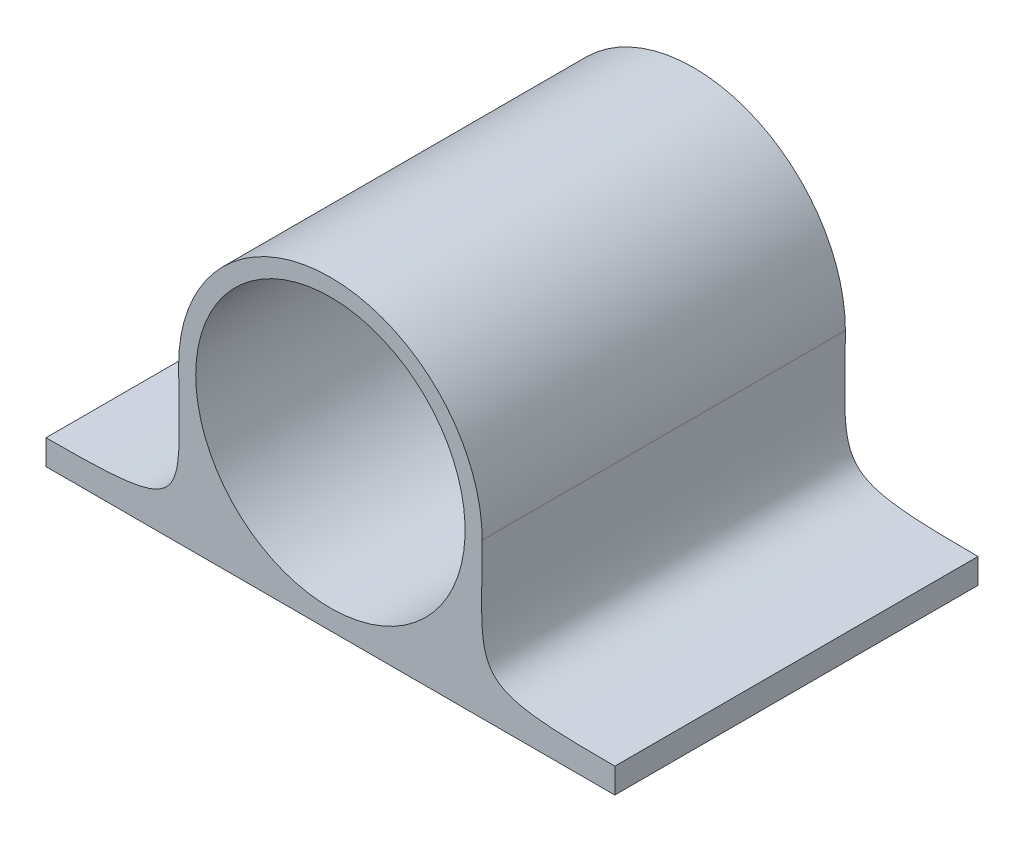
ISO-10303-21;
HEADER;
FILE_DESCRIPTION(('STEP AP214'),'2;1');
FILE_NAME('part.step','',(''),(''),'','','');
FILE_SCHEMA(('AUTOMOTIVE_DESIGN { 1 0 10303 214 1 1 1 1 }'));
ENDSEC;
DATA;
#1=APPLICATION_CONTEXT('core data for automotive mechanical design processes');
#2=APPLICATION_PROTOCOL_DEFINITION('international standard','automotive_design',2000,#1);
#3=PRODUCT_CONTEXT('',#1,'mechanical');
#4=PRODUCT('Part','Part','',(#3));
#5=PRODUCT_RELATED_PRODUCT_CATEGORY('part','',(#4));
#6=PRODUCT_DEFINITION_FORMATION('','',#4);
#7=PRODUCT_DEFINITION_CONTEXT('part definition',#1,'design');
#8=PRODUCT_DEFINITION('design','',#6,#7);
#9=PRODUCT_DEFINITION_SHAPE('','',#8);
#10=(LENGTH_UNIT() NAMED_UNIT(*) SI_UNIT(.MILLI.,.METRE.));
#11=(NAMED_UNIT(*) PLANE_ANGLE_UNIT() SI_UNIT($,.RADIAN.));
#12=(NAMED_UNIT(*) SI_UNIT($,.STERADIAN.) SOLID_ANGLE_UNIT());
#13=UNCERTAINTY_MEASURE_WITH_UNIT(LENGTH_MEASURE(1.E-05),#10,'distance_accuracy_value','');
#14=(GEOMETRIC_REPRESENTATION_CONTEXT(3) GLOBAL_UNCERTAINTY_ASSIGNED_CONTEXT((#13)) GLOBAL_UNIT_ASSIGNED_CONTEXT((#10,
#11,#12)) REPRESENTATION_CONTEXT('',''));
#15=CARTESIAN_POINT('',(0.,0.,0.));
#16=DIRECTION('',(0.,0.,1.));
#17=DIRECTION('',(1.,0.,0.));
#18=AXIS2_PLACEMENT_3D('',#15,#16,#17);
#19=CARTESIAN_POINT('',(0.,0.,58.));
#20=DIRECTION('',(0.,0.,-1.));
#21=DIRECTION('',(-1.,0.,0.));
#22=AXIS2_PLACEMENT_3D('',#19,#20,#21);
#23=CYLINDRICAL_SURFACE('',#22,24.2414756663067);
#24=CARTESIAN_POINT('',(0.,0.,0.));
#25=DIRECTION('',(0.,0.,1.));
#26=DIRECTION('',(1.,0.,0.));
#27=AXIS2_PLACEMENT_3D('',#24,#25,#26);
#28=CIRCLE('',#27,24.2414756663067);
#29=CARTESIAN_POINT('',(24.2414756663067,0.,0.));
#30=VERTEX_POINT('',#29);
#31=CARTESIAN_POINT('',(-24.2414756663067,0.,0.));
#32=VERTEX_POINT('',#31);
#33=EDGE_CURVE('E122',#30,#32,#28,.T.);
#34=ORIENTED_EDGE('',*,*,#33,.T.);
#35=DIRECTION('',(0.,0.,-1.));
#36=VECTOR('',#35,1.);
#37=CARTESIAN_POINT('',(-24.2414756663067,0.,58.));
#38=LINE('',#37,#36);
#39=CARTESIAN_POINT('',(-24.2414756663067,0.,58.));
#40=VERTEX_POINT('',#39);
#41=EDGE_CURVE('E44',#40,#32,#38,.T.);
#42=ORIENTED_EDGE('',*,*,#41,.F.);
#43=CARTESIAN_POINT('',(0.,0.,58.));
#44=DIRECTION('',(0.,0.,1.));
#45=DIRECTION('',(1.,0.,0.));
#46=AXIS2_PLACEMENT_3D('',#43,#44,#45);
#47=CIRCLE('',#46,24.2414756663067);
#48=CARTESIAN_POINT('',(24.2414756663067,0.,58.));
#49=VERTEX_POINT('',#48);
#50=EDGE_CURVE('E83',#49,#40,#47,.T.);
#51=ORIENTED_EDGE('',*,*,#50,.F.);
#52=DIRECTION('',(0.,0.,-1.));
#53=VECTOR('',#52,1.);
#54=CARTESIAN_POINT('',(24.2414756663067,0.,58.));
#55=LINE('',#54,#53);
#56=EDGE_CURVE('E115',#49,#30,#55,.T.);
#57=ORIENTED_EDGE('',*,*,#56,.T.);
#58=EDGE_LOOP('',(#34,#42,#51,#57));
#59=FACE_BOUND('',#58,.T.);
#60=ADVANCED_FACE('F35',(#59),#23,.T.);
#61=CARTESIAN_POINT('',(-45.4219408276064,-20.6662459211709,58.));
#62=CARTESIAN_POINT('',(-21.5322033053492,-20.6662459211709,58.));
#63=CARTESIAN_POINT('',(-24.2414756663066,-19.078845963853,58.));
#64=CARTESIAN_POINT('',(-24.2414756663067,0.,58.));
#65=B_SPLINE_CURVE_WITH_KNOTS('',3,(#61,#62,#63,#64),.UNSPECIFIED.,.F.,.F.,(4,4),(0.,1.),.UNSPECIFIED.);
#66=DIRECTION('',(0.,0.,-1.));
#67=VECTOR('',#66,1.);
#68=SURFACE_OF_LINEAR_EXTRUSION('',#65,#67);
#69=CARTESIAN_POINT('',(-45.4219408276064,-20.6662459211709,0.));
#70=CARTESIAN_POINT('',(-21.5322033053492,-20.6662459211709,0.));
#71=CARTESIAN_POINT('',(-24.2414756663066,-19.078845963853,0.));
#72=CARTESIAN_POINT('',(-24.2414756663067,0.,0.));
#73=B_SPLINE_CURVE_WITH_KNOTS('',3,(#69,#70,#71,#72),.UNSPECIFIED.,.F.,.F.,(4,4),(0.,1.),.UNSPECIFIED.);
#74=CARTESIAN_POINT('',(-45.4219408276064,-20.6662459211709,0.));
#75=VERTEX_POINT('',#74);
#76=EDGE_CURVE('E167',#75,#32,#73,.T.);
#77=ORIENTED_EDGE('',*,*,#76,.F.);
#78=DIRECTION('',(0.,0.,-1.));
#79=VECTOR('',#78,1.);
#80=CARTESIAN_POINT('',(-45.4219408276064,-20.6662459211709,58.));
#81=LINE('',#80,#79);
#82=CARTESIAN_POINT('',(-45.4219408276064,-20.6662459211709,58.));
#83=VERTEX_POINT('',#82);
#84=EDGE_CURVE('E194',#83,#75,#81,.T.);
#85=ORIENTED_EDGE('',*,*,#84,.F.);
#86=EDGE_CURVE('E146',#83,#40,#65,.T.);
#87=ORIENTED_EDGE('',*,*,#86,.T.);
#88=ORIENTED_EDGE('',*,*,#41,.T.);
#89=EDGE_LOOP('',(#77,#85,#87,#88));
#90=FACE_BOUND('',#89,.T.);
#91=ADVANCED_FACE('F141',(#90),#68,.T.);
#92=CARTESIAN_POINT('',(-45.4219408276064,0.,58.));
#93=DIRECTION('',(1.,0.,0.));
#94=DIRECTION('',(0.,0.,-1.));
#95=AXIS2_PLACEMENT_3D('',#92,#93,#94);
#96=PLANE('',#95);
#97=DIRECTION('',(0.,-1.,0.));
#98=VECTOR('',#97,1.);
#99=CARTESIAN_POINT('',(-45.4219408276064,0.,0.));
#100=LINE('',#99,#98);
#101=CARTESIAN_POINT('',(-45.4219408276064,-24.6662459211709,0.));
#102=VERTEX_POINT('',#101);
#103=EDGE_CURVE('E171',#75,#102,#100,.T.);
#104=ORIENTED_EDGE('',*,*,#103,.T.);
#105=DIRECTION('',(0.,0.,-1.));
#106=VECTOR('',#105,1.);
#107=CARTESIAN_POINT('',(-45.4219408276064,-24.6662459211709,58.));
#108=LINE('',#107,#106);
#109=CARTESIAN_POINT('',(-45.4219408276064,-24.6662459211709,58.));
#110=VERTEX_POINT('',#109);
#111=EDGE_CURVE('E111',#110,#102,#108,.T.);
#112=ORIENTED_EDGE('',*,*,#111,.F.);
#113=DIRECTION('',(0.,-1.,0.));
#114=VECTOR('',#113,1.);
#115=CARTESIAN_POINT('',(-45.4219408276064,0.,58.));
#116=LINE('',#115,#114);
#117=EDGE_CURVE('E98',#83,#110,#116,.T.);
#118=ORIENTED_EDGE('',*,*,#117,.F.);
#119=ORIENTED_EDGE('',*,*,#84,.T.);
#120=EDGE_LOOP('',(#104,#112,#118,#119));
#121=FACE_BOUND('',#120,.T.);
#122=ADVANCED_FACE('F138',(#121),#96,.F.);
#123=CARTESIAN_POINT('',(0.,-24.6662459211709,58.));
#124=DIRECTION('',(0.,1.,0.));
#125=DIRECTION('',(0.,0.,1.));
#126=AXIS2_PLACEMENT_3D('',#123,#124,#125);
#127=PLANE('',#126);
#128=DIRECTION('',(1.,0.,0.));
#129=VECTOR('',#128,1.);
#130=CARTESIAN_POINT('',(0.,-24.6662459211709,0.));
#131=LINE('',#130,#129);
#132=CARTESIAN_POINT('',(45.4219408276064,-24.6662459211709,0.));
#133=VERTEX_POINT('',#132);
#134=EDGE_CURVE('E107',#102,#133,#131,.T.);
#135=ORIENTED_EDGE('',*,*,#134,.T.);
#136=DIRECTION('',(0.,0.,-1.));
#137=VECTOR('',#136,1.);
#138=CARTESIAN_POINT('',(45.4219408276064,-24.6662459211709,58.));
#139=LINE('',#138,#137);
#140=CARTESIAN_POINT('',(45.4219408276064,-24.6662459211709,58.));
#141=VERTEX_POINT('',#140);
#142=EDGE_CURVE('E104',#141,#133,#139,.T.);
#143=ORIENTED_EDGE('',*,*,#142,.F.);
#144=DIRECTION('',(1.,0.,0.));
#145=VECTOR('',#144,1.);
#146=CARTESIAN_POINT('',(0.,-24.6662459211709,58.));
#147=LINE('',#146,#145);
#148=EDGE_CURVE('E92',#110,#141,#147,.T.);
#149=ORIENTED_EDGE('',*,*,#148,.F.);
#150=ORIENTED_EDGE('',*,*,#111,.T.);
#151=EDGE_LOOP('',(#135,#143,#149,#150));
#152=FACE_BOUND('',#151,.T.);
#153=ADVANCED_FACE('F105',(#152),#127,.F.);
#154=CARTESIAN_POINT('',(45.4219408276064,0.,58.));
#155=DIRECTION('',(1.,0.,0.));
#156=DIRECTION('',(0.,0.,-1.));
#157=AXIS2_PLACEMENT_3D('',#154,#155,#156);
#158=PLANE('',#157);
#159=DIRECTION('',(0.,-1.,0.));
#160=VECTOR('',#159,1.);
#161=CARTESIAN_POINT('',(45.4219408276064,0.,0.));
#162=LINE('',#161,#160);
#163=CARTESIAN_POINT('',(45.4219408276064,-20.6662459211709,0.));
#164=VERTEX_POINT('',#163);
#165=EDGE_CURVE('E183',#164,#133,#162,.T.);
#166=ORIENTED_EDGE('',*,*,#165,.F.);
#167=DIRECTION('',(0.,0.,-1.));
#168=VECTOR('',#167,1.);
#169=CARTESIAN_POINT('',(45.4219408276064,-20.6662459211709,58.));
#170=LINE('',#169,#168);
#171=CARTESIAN_POINT('',(45.4219408276064,-20.6662459211709,58.));
#172=VERTEX_POINT('',#171);
#173=EDGE_CURVE('E74',#172,#164,#170,.T.);
#174=ORIENTED_EDGE('',*,*,#173,.F.);
#175=DIRECTION('',(0.,-1.,0.));
#176=VECTOR('',#175,1.);
#177=CARTESIAN_POINT('',(45.4219408276064,0.,58.));
#178=LINE('',#177,#176);
#179=EDGE_CURVE('E96',#172,#141,#178,.T.);
#180=ORIENTED_EDGE('',*,*,#179,.T.);
#181=ORIENTED_EDGE('',*,*,#142,.T.);
#182=EDGE_LOOP('',(#166,#174,#180,#181));
#183=FACE_BOUND('',#182,.T.);
#184=ADVANCED_FACE('F113',(#183),#158,.T.);
#185=CARTESIAN_POINT('',(0.,0.,58.));
#186=DIRECTION('',(0.,0.,-1.));
#187=DIRECTION('',(-1.,0.,0.));
#188=AXIS2_PLACEMENT_3D('',#185,#186,#187);
#189=CYLINDRICAL_SURFACE('',#188,21.51);
#190=CARTESIAN_POINT('',(0.,0.,3.));
#191=DIRECTION('',(0.,0.,1.));
#192=DIRECTION('',(1.,0.,0.));
#193=AXIS2_PLACEMENT_3D('',#190,#191,#192);
#194=CIRCLE('',#193,21.51);
#195=CARTESIAN_POINT('',(-21.51,0.,3.));
#196=VERTEX_POINT('',#195);
#197=EDGE_CURVE('E11',#196,#196,#194,.T.);
#198=CARTESIAN_POINT('',(0.,0.,58.));
#199=DIRECTION('',(0.,0.,1.));
#200=DIRECTION('',(1.,0.,0.));
#201=AXIS2_PLACEMENT_3D('',#198,#199,#200);
#202=CIRCLE('',#201,21.51);
#203=CARTESIAN_POINT('',(-21.51,0.,58.));
#204=VERTEX_POINT('',#203);
#205=EDGE_CURVE('E156',#204,#204,#202,.T.);
#206=CARTESIAN_POINT('',(-21.51,0.,3.));
#207=CARTESIAN_POINT('',(-21.51,0.,3.57291666666667));
#208=CARTESIAN_POINT('',(-21.51,0.,4.14583333333333));
#209=CARTESIAN_POINT('',(-21.51,0.,5.29166666666667));
#210=CARTESIAN_POINT('',(-21.51,0.,5.86458333333334));
#211=CARTESIAN_POINT('',(-21.51,0.,7.01041666666667));
#212=CARTESIAN_POINT('',(-21.51,0.,7.58333333333334));
#213=CARTESIAN_POINT('',(-21.51,0.,8.72916666666667));
#214=CARTESIAN_POINT('',(-21.51,0.,9.30208333333334));
#215=CARTESIAN_POINT('',(-21.51,0.,10.4479166666667));
#216=CARTESIAN_POINT('',(-21.51,0.,11.0208333333333));
#217=CARTESIAN_POINT('',(-21.51,0.,12.1666666666667));
#218=CARTESIAN_POINT('',(-21.51,0.,12.7395833333333));
#219=CARTESIAN_POINT('',(-21.51,0.,13.8854166666667));
#220=CARTESIAN_POINT('',(-21.51,0.,14.4583333333333));
#221=CARTESIAN_POINT('',(-21.51,0.,15.6041666666667));
#222=CARTESIAN_POINT('',(-21.51,0.,16.1770833333333));
#223=CARTESIAN_POINT('',(-21.51,0.,17.3229166666667));
#224=CARTESIAN_POINT('',(-21.51,0.,17.8958333333333));
#225=CARTESIAN_POINT('',(-21.51,0.,19.0416666666667));
#226=CARTESIAN_POINT('',(-21.51,0.,19.6145833333333));
#227=CARTESIAN_POINT('',(-21.51,0.,20.7604166666667));
#228=CARTESIAN_POINT('',(-21.51,0.,21.3333333333333));
#229=CARTESIAN_POINT('',(-21.51,0.,22.4791666666667));
#230=CARTESIAN_POINT('',(-21.51,0.,23.0520833333333));
#231=CARTESIAN_POINT('',(-21.51,0.,24.1979166666667));
#232=CARTESIAN_POINT('',(-21.51,0.,24.7708333333333));
#233=CARTESIAN_POINT('',(-21.51,0.,25.9166666666667));
#234=CARTESIAN_POINT('',(-21.51,0.,26.4895833333333));
#235=CARTESIAN_POINT('',(-21.51,0.,27.6354166666667));
#236=CARTESIAN_POINT('',(-21.51,0.,28.2083333333333));
#237=CARTESIAN_POINT('',(-21.51,0.,29.3541666666667));
#238=CARTESIAN_POINT('',(-21.51,0.,29.9270833333333));
#239=CARTESIAN_POINT('',(-21.51,0.,31.0729166666667));
#240=CARTESIAN_POINT('',(-21.51,0.,31.6458333333333));
#241=CARTESIAN_POINT('',(-21.51,0.,32.7916666666667));
#242=CARTESIAN_POINT('',(-21.51,0.,33.3645833333333));
#243=CARTESIAN_POINT('',(-21.51,0.,34.5104166666667));
#244=CARTESIAN_POINT('',(-21.51,0.,35.0833333333333));
#245=CARTESIAN_POINT('',(-21.51,0.,36.2291666666667));
#246=CARTESIAN_POINT('',(-21.51,0.,36.8020833333333));
#247=CARTESIAN_POINT('',(-21.51,0.,37.9479166666667));
#248=CARTESIAN_POINT('',(-21.51,0.,38.5208333333333));
#249=CARTESIAN_POINT('',(-21.51,0.,39.6666666666667));
#250=CARTESIAN_POINT('',(-21.51,0.,40.2395833333333));
#251=CARTESIAN_POINT('',(-21.51,0.,41.3854166666667));
#252=CARTESIAN_POINT('',(-21.51,0.,41.9583333333333));
#253=CARTESIAN_POINT('',(-21.51,0.,43.1041666666667));
#254=CARTESIAN_POINT('',(-21.51,0.,43.6770833333333));
#255=CARTESIAN_POINT('',(-21.51,0.,44.8229166666667));
#256=CARTESIAN_POINT('',(-21.51,0.,45.3958333333333));
#257=CARTESIAN_POINT('',(-21.51,0.,46.5416666666667));
#258=CARTESIAN_POINT('',(-21.51,0.,47.1145833333333));
#259=CARTESIAN_POINT('',(-21.51,0.,48.2604166666667));
#260=CARTESIAN_POINT('',(-21.51,0.,48.8333333333333));
#261=CARTESIAN_POINT('',(-21.51,0.,49.9791666666667));
#262=CARTESIAN_POINT('',(-21.51,0.,50.5520833333333));
#263=CARTESIAN_POINT('',(-21.51,0.,51.6979166666667));
#264=CARTESIAN_POINT('',(-21.51,0.,52.2708333333333));
#265=CARTESIAN_POINT('',(-21.51,0.,53.4166666666667));
#266=CARTESIAN_POINT('',(-21.51,0.,53.9895833333333));
#267=CARTESIAN_POINT('',(-21.51,0.,55.1354166666667));
#268=CARTESIAN_POINT('',(-21.51,0.,55.7083333333333));
#269=CARTESIAN_POINT('',(-21.51,0.,56.8541666666667));
#270=CARTESIAN_POINT('',(-21.51,0.,57.4270833333333));
#271=CARTESIAN_POINT('',(-21.51,0.,58.));
#272=B_SPLINE_CURVE_WITH_KNOTS('',3,(#206,#207,#208,#209,#210,#211,#212,#213,#214,#215,#216,
#217,#218,#219,#220,#221,#222,#223,#224,#225,#226,#227,#228,#229,#230,#231,#232,#233,#234,#235,
#236,#237,#238,#239,#240,#241,#242,#243,#244,#245,#246,#247,#248,#249,#250,#251,#252,#253,#254,
#255,#256,#257,#258,#259,#260,#261,#262,#263,#264,#265,#266,#267,#268,#269,#270,#271),
.UNSPECIFIED.,.F.,.F.,(4,2,2,2,2,2,2,2,2,2,2,2,2,2,2,2,2,2,2,2,2,2,2,2,2,2,2,2,2,2,2,2,4),(0.,
1.71875,3.4375,5.15625,6.875,8.59375,10.3125,12.03125,13.75,15.46875,17.1875,18.90625,20.625,
22.34375,24.0625,25.78125,27.5,29.21875,30.9375,32.65625,34.375,36.09375,37.8125,39.53125,41.25,
42.96875,44.6875,46.40625,48.125,49.84375,51.5625,53.28125,55.),.UNSPECIFIED.);
#273=EDGE_CURVE('BSEAM37',#196,#204,#272,.T.);
#274=ORIENTED_EDGE('',*,*,#197,.F.);
#275=ORIENTED_EDGE('',*,*,#205,.T.);
#276=ORIENTED_EDGE('',*,*,#273,.T.);
#277=ORIENTED_EDGE('',*,*,#273,.F.);
#278=EDGE_LOOP('',(#274,#276,#275,#277));
#279=FACE_BOUND('',#278,.T.);
#280=ADVANCED_FACE('F37',(#279),#189,.F.);
#281=CARTESIAN_POINT('',(45.4219408276064,-20.6662459211709,58.));
#282=CARTESIAN_POINT('',(21.5322033053492,-20.6662459211709,58.));
#283=CARTESIAN_POINT('',(24.2414756663066,-19.078845963853,58.));
#284=CARTESIAN_POINT('',(24.2414756663067,0.,58.));
#285=B_SPLINE_CURVE_WITH_KNOTS('',3,(#281,#282,#283,#284),.UNSPECIFIED.,.F.,.F.,(4,4),(0.,1.),.UNSPECIFIED.);
#286=DIRECTION('',(0.,0.,-1.));
#287=VECTOR('',#286,1.);
#288=SURFACE_OF_LINEAR_EXTRUSION('',#285,#287);
#289=CARTESIAN_POINT('',(45.4219408276064,-20.6662459211709,0.));
#290=CARTESIAN_POINT('',(21.5322033053492,-20.6662459211709,0.));
#291=CARTESIAN_POINT('',(24.2414756663066,-19.078845963853,0.));
#292=CARTESIAN_POINT('',(24.2414756663067,0.,0.));
#293=B_SPLINE_CURVE_WITH_KNOTS('',3,(#289,#290,#291,#292),.UNSPECIFIED.,.F.,.F.,(4,4),(0.,1.),.UNSPECIFIED.);
#294=EDGE_CURVE('E77',#164,#30,#293,.T.);
#295=ORIENTED_EDGE('',*,*,#294,.T.);
#296=ORIENTED_EDGE('',*,*,#56,.F.);
#297=EDGE_CURVE('E52',#172,#49,#285,.T.);
#298=ORIENTED_EDGE('',*,*,#297,.F.);
#299=ORIENTED_EDGE('',*,*,#173,.T.);
#300=EDGE_LOOP('',(#295,#296,#298,#299));
#301=FACE_BOUND('',#300,.T.);
#302=ADVANCED_FACE('F128',(#301),#288,.F.);
#303=CARTESIAN_POINT('',(0.,0.,58.));
#304=DIRECTION('',(0.,0.,1.));
#305=DIRECTION('',(1.,0.,0.));
#306=AXIS2_PLACEMENT_3D('',#303,#304,#305);
#307=PLANE('',#306);
#308=ORIENTED_EDGE('',*,*,#205,.F.);
#309=EDGE_LOOP('',(#308));
#310=FACE_BOUND('',#309,.T.);
#311=ORIENTED_EDGE('',*,*,#50,.T.);
#312=ORIENTED_EDGE('',*,*,#86,.F.);
#313=ORIENTED_EDGE('',*,*,#117,.T.);
#314=ORIENTED_EDGE('',*,*,#148,.T.);
#315=ORIENTED_EDGE('',*,*,#179,.F.);
#316=ORIENTED_EDGE('',*,*,#297,.T.);
#317=EDGE_LOOP('',(#311,#312,#313,#314,#315,#316));
#318=FACE_BOUND('',#317,.T.);
#319=ADVANCED_FACE('F94',(#310,#318),#307,.T.);
#320=CARTESIAN_POINT('',(0.,0.,0.));
#321=DIRECTION('',(0.,0.,1.));
#322=DIRECTION('',(1.,0.,0.));
#323=AXIS2_PLACEMENT_3D('',#320,#321,#322);
#324=PLANE('',#323);
#325=ORIENTED_EDGE('',*,*,#33,.F.);
#326=ORIENTED_EDGE('',*,*,#294,.F.);
#327=ORIENTED_EDGE('',*,*,#165,.T.);
#328=ORIENTED_EDGE('',*,*,#134,.F.);
#329=ORIENTED_EDGE('',*,*,#103,.F.);
#330=ORIENTED_EDGE('',*,*,#76,.T.);
#331=EDGE_LOOP('',(#325,#326,#327,#328,#329,#330));
#332=FACE_BOUND('',#331,.T.);
#333=CARTESIAN_POINT('',(0.,0.,0.));
#334=DIRECTION('',(0.,0.,1.));
#335=DIRECTION('',(1.,0.,0.));
#336=AXIS2_PLACEMENT_3D('',#333,#334,#335);
#337=CIRCLE('',#336,5.15);
#338=CARTESIAN_POINT('',(5.15,0.,0.));
#339=VERTEX_POINT('',#338);
#340=EDGE_CURVE('E159',#339,#339,#337,.T.);
#341=ORIENTED_EDGE('',*,*,#340,.T.);
#342=EDGE_LOOP('',(#341));
#343=FACE_BOUND('',#342,.T.);
#344=ADVANCED_FACE('F132',(#332,#343),#324,.F.);
#345=CARTESIAN_POINT('',(0.,0.,3.));
#346=DIRECTION('',(0.,0.,-1.));
#347=DIRECTION('',(-1.,0.,0.));
#348=AXIS2_PLACEMENT_3D('',#345,#346,#347);
#349=CYLINDRICAL_SURFACE('',#348,5.15);
#350=CARTESIAN_POINT('',(0.,0.,3.));
#351=DIRECTION('',(0.,0.,1.));
#352=DIRECTION('',(1.,0.,0.));
#353=AXIS2_PLACEMENT_3D('',#350,#351,#352);
#354=CIRCLE('',#353,5.15);
#355=CARTESIAN_POINT('',(5.15,0.,3.));
#356=VERTEX_POINT('',#355);
#357=EDGE_CURVE('E162',#356,#356,#354,.T.);
#358=ORIENTED_EDGE('',*,*,#357,.T.);
#359=EDGE_LOOP('',(#358));
#360=FACE_BOUND('',#359,.T.);
#361=ORIENTED_EDGE('',*,*,#340,.F.);
#362=EDGE_LOOP('',(#361));
#363=FACE_BOUND('',#362,.T.);
#364=ADVANCED_FACE('F197',(#360,#363),#349,.F.);
#365=CARTESIAN_POINT('',(0.,0.,3.));
#366=DIRECTION('',(0.,0.,1.));
#367=DIRECTION('',(1.,0.,0.));
#368=AXIS2_PLACEMENT_3D('',#365,#366,#367);
#369=PLANE('',#368);
#370=ORIENTED_EDGE('',*,*,#357,.F.);
#371=EDGE_LOOP('',(#370));
#372=FACE_BOUND('',#371,.T.);
#373=ORIENTED_EDGE('',*,*,#197,.T.);
#374=EDGE_LOOP('',(#373));
#375=FACE_BOUND('',#374,.T.);
#376=ADVANCED_FACE('F201',(#372,#375),#369,.T.);
#377=CLOSED_SHELL('',(#60,#91,#122,#153,#184,#280,#302,#319,#344,#364,#376));
#378=MANIFOLD_SOLID_BREP('B2',#377);
#379=ADVANCED_BREP_SHAPE_REPRESENTATION('',(#18,#378),#14);
#380=SHAPE_DEFINITION_REPRESENTATION(#9,#379);
ENDSEC;
END-ISO-10303-21;
